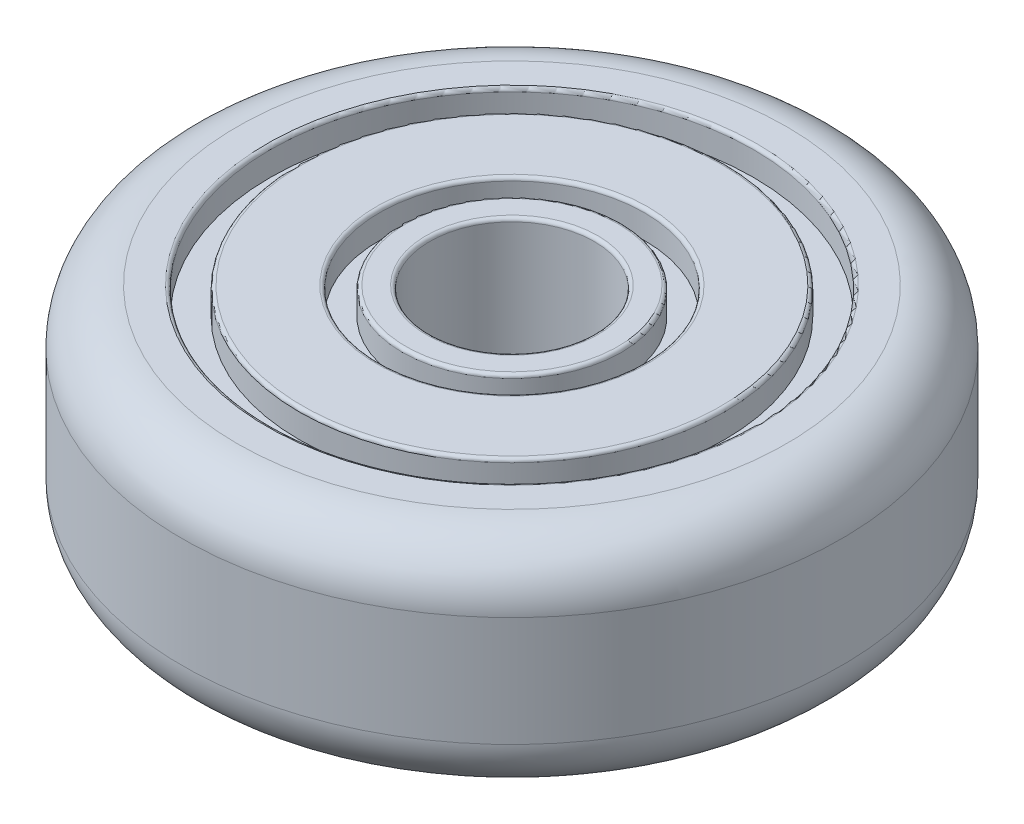
ISO-10303-21;
HEADER;
FILE_DESCRIPTION(('STEP AP214'),'2;1');
FILE_NAME('part.step','',(''),(''),'','','');
FILE_SCHEMA(('AUTOMOTIVE_DESIGN { 1 0 10303 214 1 1 1 1 }'));
ENDSEC;
DATA;
#1=APPLICATION_CONTEXT('core data for automotive mechanical design processes');
#2=APPLICATION_PROTOCOL_DEFINITION('international standard','automotive_design',2000,#1);
#3=PRODUCT_CONTEXT('',#1,'mechanical');
#4=PRODUCT('Part','Part','',(#3));
#5=PRODUCT_RELATED_PRODUCT_CATEGORY('part','',(#4));
#6=PRODUCT_DEFINITION_FORMATION('','',#4);
#7=PRODUCT_DEFINITION_CONTEXT('part definition',#1,'design');
#8=PRODUCT_DEFINITION('design','',#6,#7);
#9=PRODUCT_DEFINITION_SHAPE('','',#8);
#10=(LENGTH_UNIT() NAMED_UNIT(*) SI_UNIT(.MILLI.,.METRE.));
#11=(NAMED_UNIT(*) PLANE_ANGLE_UNIT() SI_UNIT($,.RADIAN.));
#12=(NAMED_UNIT(*) SI_UNIT($,.STERADIAN.) SOLID_ANGLE_UNIT());
#13=UNCERTAINTY_MEASURE_WITH_UNIT(LENGTH_MEASURE(1.E-05),#10,'distance_accuracy_value','');
#14=(GEOMETRIC_REPRESENTATION_CONTEXT(3) GLOBAL_UNCERTAINTY_ASSIGNED_CONTEXT((#13)) GLOBAL_UNIT_ASSIGNED_CONTEXT((#10,
#11,#12)) REPRESENTATION_CONTEXT('',''));
#15=CARTESIAN_POINT('',(0.,0.,0.));
#16=DIRECTION('',(0.,0.,1.));
#17=DIRECTION('',(1.,0.,0.));
#18=AXIS2_PLACEMENT_3D('',#15,#16,#17);
#19=CARTESIAN_POINT('',(0.,0.,0.));
#20=DIRECTION('',(0.,1.,0.));
#21=DIRECTION('',(0.,0.,-1.));
#22=AXIS2_PLACEMENT_3D('',#19,#20,#21);
#23=PLANE('',#22);
#24=CARTESIAN_POINT('',(0.,0.,0.));
#25=DIRECTION('',(0.,-1.,0.));
#26=DIRECTION('',(0.,0.,-1.));
#27=AXIS2_PLACEMENT_3D('',#24,#25,#26);
#28=CIRCLE('',#27,3.);
#29=CARTESIAN_POINT('',(0.,0.,-3.));
#30=VERTEX_POINT('',#29);
#31=EDGE_CURVE('E96',#30,#30,#28,.T.);
#32=ORIENTED_EDGE('',*,*,#31,.F.);
#33=EDGE_LOOP('',(#32));
#34=FACE_BOUND('',#33,.T.);
#35=CARTESIAN_POINT('',(0.,0.,0.));
#36=DIRECTION('',(0.,-1.,0.));
#37=DIRECTION('',(0.,0.,-1.));
#38=AXIS2_PLACEMENT_3D('',#35,#36,#37);
#39=CIRCLE('',#38,3.99081324353973);
#40=CARTESIAN_POINT('',(0.,0.,-3.99081324353973));
#41=VERTEX_POINT('',#40);
#42=EDGE_CURVE('E128',#41,#41,#39,.T.);
#43=ORIENTED_EDGE('',*,*,#42,.T.);
#44=EDGE_LOOP('',(#43));
#45=FACE_BOUND('',#44,.T.);
#46=ADVANCED_FACE('F46',(#34,#45),#23,.F.);
#47=CARTESIAN_POINT('',(0.,8.,0.));
#48=DIRECTION('',(0.,1.,0.));
#49=DIRECTION('',(0.,0.,-1.));
#50=AXIS2_PLACEMENT_3D('',#47,#48,#49);
#51=PLANE('',#50);
#52=CARTESIAN_POINT('',(0.,8.,0.));
#53=DIRECTION('',(0.,-1.,0.));
#54=DIRECTION('',(0.,0.,-1.));
#55=AXIS2_PLACEMENT_3D('',#52,#53,#54);
#56=CIRCLE('',#55,3.125);
#57=CARTESIAN_POINT('',(0.,8.,-3.125));
#58=VERTEX_POINT('',#57);
#59=EDGE_CURVE('E69',#58,#58,#56,.F.);
#60=ORIENTED_EDGE('',*,*,#59,.F.);
#61=EDGE_LOOP('',(#60));
#62=FACE_BOUND('',#61,.T.);
#63=CARTESIAN_POINT('',(0.,8.,0.));
#64=DIRECTION('',(0.,-1.,0.));
#65=DIRECTION('',(0.,0.,-1.));
#66=AXIS2_PLACEMENT_3D('',#63,#64,#65);
#67=CIRCLE('',#66,3.86581324353973);
#68=CARTESIAN_POINT('',(0.,8.,-3.86581324353973));
#69=VERTEX_POINT('',#68);
#70=EDGE_CURVE('E72',#69,#69,#67,.T.);
#71=ORIENTED_EDGE('',*,*,#70,.F.);
#72=EDGE_LOOP('',(#71));
#73=FACE_BOUND('',#72,.T.);
#74=ADVANCED_FACE('F176',(#62,#73),#51,.T.);
#75=CARTESIAN_POINT('',(0.,8.,0.));
#76=DIRECTION('',(0.,-1.,0.));
#77=DIRECTION('',(0.,0.,-1.));
#78=AXIS2_PLACEMENT_3D('',#75,#76,#77);
#79=CIRCLE('',#78,8.92068996697586);
#80=CARTESIAN_POINT('',(0.,8.,-8.92068996697586));
#81=VERTEX_POINT('',#80);
#82=EDGE_CURVE('E78',#81,#81,#79,.F.);
#83=ORIENTED_EDGE('',*,*,#82,.F.);
#84=EDGE_LOOP('',(#83));
#85=FACE_BOUND('',#84,.T.);
#86=CARTESIAN_POINT('',(0.,8.,0.));
#87=DIRECTION('',(0.,-1.,0.));
#88=DIRECTION('',(0.,0.,-1.));
#89=AXIS2_PLACEMENT_3D('',#86,#87,#88);
#90=CIRCLE('',#89,10.);
#91=CARTESIAN_POINT('',(0.,8.,-10.));
#92=VERTEX_POINT('',#91);
#93=EDGE_CURVE('E84',#92,#92,#90,.T.);
#94=ORIENTED_EDGE('',*,*,#93,.F.);
#95=EDGE_LOOP('',(#94));
#96=FACE_BOUND('',#95,.T.);
#97=ADVANCED_FACE('F181',(#85,#96),#51,.T.);
#98=CARTESIAN_POINT('',(0.,0.,0.));
#99=DIRECTION('',(0.,-1.,0.));
#100=DIRECTION('',(0.,0.,-1.));
#101=AXIS2_PLACEMENT_3D('',#98,#99,#100);
#102=CIRCLE('',#101,8.79568996697586);
#103=CARTESIAN_POINT('',(0.,0.,-8.79568996697586));
#104=VERTEX_POINT('',#103);
#105=EDGE_CURVE('E112',#104,#104,#102,.T.);
#106=ORIENTED_EDGE('',*,*,#105,.F.);
#107=EDGE_LOOP('',(#106));
#108=FACE_BOUND('',#107,.T.);
#109=CARTESIAN_POINT('',(0.,0.,0.));
#110=DIRECTION('',(0.,-1.,0.));
#111=DIRECTION('',(0.,0.,-1.));
#112=AXIS2_PLACEMENT_3D('',#109,#110,#111);
#113=CIRCLE('',#112,10.);
#114=CARTESIAN_POINT('',(0.,0.,-10.));
#115=VERTEX_POINT('',#114);
#116=EDGE_CURVE('E87',#115,#115,#113,.F.);
#117=ORIENTED_EDGE('',*,*,#116,.F.);
#118=EDGE_LOOP('',(#117));
#119=FACE_BOUND('',#118,.T.);
#120=ADVANCED_FACE('F157',(#108,#119),#23,.F.);
#121=CARTESIAN_POINT('',(0.,8.,0.));
#122=DIRECTION('',(0.,-1.,0.));
#123=DIRECTION('',(0.,0.,1.));
#124=AXIS2_PLACEMENT_3D('',#121,#122,#123);
#125=CYLINDRICAL_SURFACE('',#124,12.);
#126=CARTESIAN_POINT('',(0.,2.,0.));
#127=DIRECTION('',(0.,-1.,0.));
#128=DIRECTION('',(0.,0.,-1.));
#129=AXIS2_PLACEMENT_3D('',#126,#127,#128);
#130=CIRCLE('',#129,12.);
#131=CARTESIAN_POINT('',(0.,2.,-12.));
#132=VERTEX_POINT('',#131);
#133=EDGE_CURVE('E90',#132,#132,#130,.T.);
#134=ORIENTED_EDGE('',*,*,#133,.F.);
#135=EDGE_LOOP('',(#134));
#136=FACE_BOUND('',#135,.T.);
#137=CARTESIAN_POINT('',(0.,6.,0.));
#138=DIRECTION('',(0.,-1.,0.));
#139=DIRECTION('',(0.,0.,-1.));
#140=AXIS2_PLACEMENT_3D('',#137,#138,#139);
#141=CIRCLE('',#140,12.);
#142=CARTESIAN_POINT('',(0.,6.,-12.));
#143=VERTEX_POINT('',#142);
#144=EDGE_CURVE('E93',#143,#143,#141,.F.);
#145=ORIENTED_EDGE('',*,*,#144,.F.);
#146=EDGE_LOOP('',(#145));
#147=FACE_BOUND('',#146,.T.);
#148=ADVANCED_FACE('F189',(#136,#147),#125,.T.);
#149=CARTESIAN_POINT('',(0.,8.,0.));
#150=DIRECTION('',(0.,-1.,0.));
#151=DIRECTION('',(0.,0.,1.));
#152=AXIS2_PLACEMENT_3D('',#149,#150,#151);
#153=CYLINDRICAL_SURFACE('',#152,3.);
#154=CARTESIAN_POINT('',(0.,7.875,0.));
#155=DIRECTION('',(0.,-1.,0.));
#156=DIRECTION('',(0.,0.,-1.));
#157=AXIS2_PLACEMENT_3D('',#154,#155,#156);
#158=CIRCLE('',#157,3.);
#159=CARTESIAN_POINT('',(0.,7.875,-3.));
#160=VERTEX_POINT('',#159);
#161=EDGE_CURVE('E75',#160,#160,#158,.T.);
#162=ORIENTED_EDGE('',*,*,#161,.F.);
#163=EDGE_LOOP('',(#162));
#164=FACE_BOUND('',#163,.T.);
#165=ORIENTED_EDGE('',*,*,#31,.T.);
#166=EDGE_LOOP('',(#165));
#167=FACE_BOUND('',#166,.T.);
#168=ADVANCED_FACE('F196',(#164,#167),#153,.F.);
#169=CARTESIAN_POINT('',(0.,2.,0.));
#170=DIRECTION('',(0.,1.,0.));
#171=DIRECTION('',(0.,0.,-1.));
#172=AXIS2_PLACEMENT_3D('',#169,#170,#171);
#173=TOROIDAL_SURFACE('',#172,10.,2.);
#174=ORIENTED_EDGE('',*,*,#116,.T.);
#175=EDGE_LOOP('',(#174));
#176=FACE_BOUND('',#175,.T.);
#177=ORIENTED_EDGE('',*,*,#133,.T.);
#178=EDGE_LOOP('',(#177));
#179=FACE_BOUND('',#178,.T.);
#180=ADVANCED_FACE('F203',(#176,#179),#173,.T.);
#181=CARTESIAN_POINT('',(0.,6.,0.));
#182=DIRECTION('',(0.,1.,0.));
#183=DIRECTION('',(0.,0.,-1.));
#184=AXIS2_PLACEMENT_3D('',#181,#182,#183);
#185=TOROIDAL_SURFACE('',#184,10.,2.);
#186=ORIENTED_EDGE('',*,*,#144,.T.);
#187=EDGE_LOOP('',(#186));
#188=FACE_BOUND('',#187,.T.);
#189=ORIENTED_EDGE('',*,*,#93,.T.);
#190=EDGE_LOOP('',(#189));
#191=FACE_BOUND('',#190,.T.);
#192=ADVANCED_FACE('F206',(#188,#191),#185,.T.);
#193=CARTESIAN_POINT('',(0.,7.,0.));
#194=DIRECTION('',(0.,1.,0.));
#195=DIRECTION('',(0.,0.,-1.));
#196=AXIS2_PLACEMENT_3D('',#193,#194,#195);
#197=CYLINDRICAL_SURFACE('',#196,7.7454866043456);
#198=CARTESIAN_POINT('',(0.,7.875,0.));
#199=DIRECTION('',(0.,-1.,0.));
#200=DIRECTION('',(0.,0.,-1.));
#201=AXIS2_PLACEMENT_3D('',#198,#199,#200);
#202=CIRCLE('',#201,7.7454866043456);
#203=CARTESIAN_POINT('',(0.,7.875,-7.7454866043456));
#204=VERTEX_POINT('',#203);
#205=EDGE_CURVE('E11',#204,#204,#202,.F.);
#206=ORIENTED_EDGE('',*,*,#205,.F.);
#207=EDGE_LOOP('',(#206));
#208=FACE_BOUND('',#207,.T.);
#209=CARTESIAN_POINT('',(0.,7.,0.));
#210=DIRECTION('',(0.,-1.,0.));
#211=DIRECTION('',(0.,0.,-1.));
#212=AXIS2_PLACEMENT_3D('',#209,#210,#211);
#213=CIRCLE('',#212,7.7454866043456);
#214=CARTESIAN_POINT('',(0.,7.,-7.7454866043456));
#215=VERTEX_POINT('',#214);
#216=EDGE_CURVE('E102',#215,#215,#213,.T.);
#217=ORIENTED_EDGE('',*,*,#216,.F.);
#218=EDGE_LOOP('',(#217));
#219=FACE_BOUND('',#218,.T.);
#220=ADVANCED_FACE('F214',(#208,#219),#197,.T.);
#221=CARTESIAN_POINT('',(0.,7.,0.));
#222=DIRECTION('',(0.,1.,0.));
#223=DIRECTION('',(0.,0.,-1.));
#224=AXIS2_PLACEMENT_3D('',#221,#222,#223);
#225=CYLINDRICAL_SURFACE('',#224,8.79568996697586);
#226=CARTESIAN_POINT('',(0.,7.875,0.));
#227=DIRECTION('',(0.,-1.,0.));
#228=DIRECTION('',(0.,0.,-1.));
#229=AXIS2_PLACEMENT_3D('',#226,#227,#228);
#230=CIRCLE('',#229,8.79568996697586);
#231=CARTESIAN_POINT('',(0.,7.875,-8.79568996697586));
#232=VERTEX_POINT('',#231);
#233=EDGE_CURVE('E81',#232,#232,#230,.T.);
#234=ORIENTED_EDGE('',*,*,#233,.F.);
#235=EDGE_LOOP('',(#234));
#236=FACE_BOUND('',#235,.T.);
#237=CARTESIAN_POINT('',(0.,7.,0.));
#238=DIRECTION('',(0.,-1.,0.));
#239=DIRECTION('',(0.,0.,-1.));
#240=AXIS2_PLACEMENT_3D('',#237,#238,#239);
#241=CIRCLE('',#240,8.79568996697586);
#242=CARTESIAN_POINT('',(0.,7.,-8.79568996697586));
#243=VERTEX_POINT('',#242);
#244=EDGE_CURVE('E99',#243,#243,#241,.T.);
#245=ORIENTED_EDGE('',*,*,#244,.T.);
#246=EDGE_LOOP('',(#245));
#247=FACE_BOUND('',#246,.T.);
#248=ADVANCED_FACE('F221',(#236,#247),#225,.F.);
#249=CARTESIAN_POINT('',(0.,7.,0.));
#250=DIRECTION('',(0.,1.,0.));
#251=DIRECTION('',(0.,0.,-1.));
#252=AXIS2_PLACEMENT_3D('',#249,#250,#251);
#253=PLANE('',#252);
#254=ORIENTED_EDGE('',*,*,#216,.T.);
#255=EDGE_LOOP('',(#254));
#256=FACE_BOUND('',#255,.T.);
#257=ORIENTED_EDGE('',*,*,#244,.F.);
#258=EDGE_LOOP('',(#257));
#259=FACE_BOUND('',#258,.T.);
#260=ADVANCED_FACE('F255',(#256,#259),#253,.T.);
#261=CARTESIAN_POINT('',(0.,8.,0.));
#262=DIRECTION('',(0.,-1.,0.));
#263=DIRECTION('',(0.,0.,-1.));
#264=AXIS2_PLACEMENT_3D('',#261,#262,#263);
#265=CIRCLE('',#264,4.94705703683497);
#266=CARTESIAN_POINT('',(0.,8.,-4.94705703683497));
#267=VERTEX_POINT('',#266);
#268=EDGE_CURVE('E53',#267,#267,#265,.F.);
#269=ORIENTED_EDGE('',*,*,#268,.F.);
#270=EDGE_LOOP('',(#269));
#271=FACE_BOUND('',#270,.T.);
#272=CARTESIAN_POINT('',(0.,8.,0.));
#273=DIRECTION('',(0.,-1.,0.));
#274=DIRECTION('',(0.,0.,-1.));
#275=AXIS2_PLACEMENT_3D('',#272,#273,#274);
#276=CIRCLE('',#275,7.6204866043456);
#277=CARTESIAN_POINT('',(0.,8.,-7.6204866043456));
#278=VERTEX_POINT('',#277);
#279=EDGE_CURVE('E57',#278,#278,#276,.T.);
#280=ORIENTED_EDGE('',*,*,#279,.F.);
#281=EDGE_LOOP('',(#280));
#282=FACE_BOUND('',#281,.T.);
#283=ADVANCED_FACE('F184',(#271,#282),#51,.T.);
#284=CARTESIAN_POINT('',(0.,7.,0.));
#285=DIRECTION('',(0.,1.,0.));
#286=DIRECTION('',(0.,0.,-1.));
#287=AXIS2_PLACEMENT_3D('',#284,#285,#286);
#288=CYLINDRICAL_SURFACE('',#287,3.99081324353973);
#289=CARTESIAN_POINT('',(0.,7.875,0.));
#290=DIRECTION('',(0.,-1.,0.));
#291=DIRECTION('',(0.,0.,-1.));
#292=AXIS2_PLACEMENT_3D('',#289,#290,#291);
#293=CIRCLE('',#292,3.99081324353973);
#294=CARTESIAN_POINT('',(0.,7.875,-3.99081324353973));
#295=VERTEX_POINT('',#294);
#296=EDGE_CURVE('E66',#295,#295,#293,.F.);
#297=ORIENTED_EDGE('',*,*,#296,.F.);
#298=EDGE_LOOP('',(#297));
#299=FACE_BOUND('',#298,.T.);
#300=CARTESIAN_POINT('',(0.,7.,0.));
#301=DIRECTION('',(0.,-1.,0.));
#302=DIRECTION('',(0.,0.,-1.));
#303=AXIS2_PLACEMENT_3D('',#300,#301,#302);
#304=CIRCLE('',#303,3.99081324353973);
#305=CARTESIAN_POINT('',(0.,7.,-3.99081324353973));
#306=VERTEX_POINT('',#305);
#307=EDGE_CURVE('E108',#306,#306,#304,.T.);
#308=ORIENTED_EDGE('',*,*,#307,.F.);
#309=EDGE_LOOP('',(#308));
#310=FACE_BOUND('',#309,.T.);
#311=ADVANCED_FACE('F245',(#299,#310),#288,.T.);
#312=CARTESIAN_POINT('',(0.,7.,0.));
#313=DIRECTION('',(0.,1.,0.));
#314=DIRECTION('',(0.,0.,-1.));
#315=AXIS2_PLACEMENT_3D('',#312,#313,#314);
#316=CYLINDRICAL_SURFACE('',#315,4.82205703683497);
#317=CARTESIAN_POINT('',(0.,7.875,0.));
#318=DIRECTION('',(0.,-1.,0.));
#319=DIRECTION('',(0.,0.,-1.));
#320=AXIS2_PLACEMENT_3D('',#317,#318,#319);
#321=CIRCLE('',#320,4.82205703683497);
#322=CARTESIAN_POINT('',(0.,7.875,-4.82205703683497));
#323=VERTEX_POINT('',#322);
#324=EDGE_CURVE('E61',#323,#323,#321,.T.);
#325=ORIENTED_EDGE('',*,*,#324,.F.);
#326=EDGE_LOOP('',(#325));
#327=FACE_BOUND('',#326,.T.);
#328=CARTESIAN_POINT('',(0.,7.,0.));
#329=DIRECTION('',(0.,-1.,0.));
#330=DIRECTION('',(0.,0.,-1.));
#331=AXIS2_PLACEMENT_3D('',#328,#329,#330);
#332=CIRCLE('',#331,4.82205703683497);
#333=CARTESIAN_POINT('',(0.,7.,-4.82205703683497));
#334=VERTEX_POINT('',#333);
#335=EDGE_CURVE('E105',#334,#334,#332,.T.);
#336=ORIENTED_EDGE('',*,*,#335,.T.);
#337=EDGE_LOOP('',(#336));
#338=FACE_BOUND('',#337,.T.);
#339=ADVANCED_FACE('F172',(#327,#338),#316,.F.);
#340=CARTESIAN_POINT('',(0.,7.,0.));
#341=DIRECTION('',(0.,1.,0.));
#342=DIRECTION('',(0.,0.,-1.));
#343=AXIS2_PLACEMENT_3D('',#340,#341,#342);
#344=PLANE('',#343);
#345=ORIENTED_EDGE('',*,*,#307,.T.);
#346=EDGE_LOOP('',(#345));
#347=FACE_BOUND('',#346,.T.);
#348=ORIENTED_EDGE('',*,*,#335,.F.);
#349=EDGE_LOOP('',(#348));
#350=FACE_BOUND('',#349,.T.);
#351=ADVANCED_FACE('F163',(#347,#350),#344,.T.);
#352=CARTESIAN_POINT('',(0.,1.,0.));
#353=DIRECTION('',(0.,-1.,0.));
#354=DIRECTION('',(0.,0.,1.));
#355=AXIS2_PLACEMENT_3D('',#352,#353,#354);
#356=CYLINDRICAL_SURFACE('',#355,7.7454866043456);
#357=CARTESIAN_POINT('',(0.,1.,0.));
#358=DIRECTION('',(0.,-1.,0.));
#359=DIRECTION('',(0.,0.,-1.));
#360=AXIS2_PLACEMENT_3D('',#357,#358,#359);
#361=CIRCLE('',#360,7.7454866043456);
#362=CARTESIAN_POINT('',(0.,1.,-7.7454866043456));
#363=VERTEX_POINT('',#362);
#364=EDGE_CURVE('E115',#363,#363,#361,.T.);
#365=ORIENTED_EDGE('',*,*,#364,.T.);
#366=EDGE_LOOP('',(#365));
#367=FACE_BOUND('',#366,.T.);
#368=CARTESIAN_POINT('',(0.,0.,0.));
#369=DIRECTION('',(0.,-1.,0.));
#370=DIRECTION('',(0.,0.,-1.));
#371=AXIS2_PLACEMENT_3D('',#368,#369,#370);
#372=CIRCLE('',#371,7.7454866043456);
#373=CARTESIAN_POINT('',(0.,0.,-7.7454866043456));
#374=VERTEX_POINT('',#373);
#375=EDGE_CURVE('E116',#374,#374,#372,.T.);
#376=ORIENTED_EDGE('',*,*,#375,.F.);
#377=EDGE_LOOP('',(#376));
#378=FACE_BOUND('',#377,.T.);
#379=ADVANCED_FACE('F160',(#367,#378),#356,.T.);
#380=CARTESIAN_POINT('',(0.,1.,0.));
#381=DIRECTION('',(0.,-1.,0.));
#382=DIRECTION('',(0.,0.,1.));
#383=AXIS2_PLACEMENT_3D('',#380,#381,#382);
#384=CYLINDRICAL_SURFACE('',#383,8.79568996697586);
#385=CARTESIAN_POINT('',(0.,1.,0.));
#386=DIRECTION('',(0.,-1.,0.));
#387=DIRECTION('',(0.,0.,-1.));
#388=AXIS2_PLACEMENT_3D('',#385,#386,#387);
#389=CIRCLE('',#388,8.79568996697586);
#390=CARTESIAN_POINT('',(0.,1.,-8.79568996697586));
#391=VERTEX_POINT('',#390);
#392=EDGE_CURVE('E111',#391,#391,#389,.T.);
#393=ORIENTED_EDGE('',*,*,#392,.F.);
#394=EDGE_LOOP('',(#393));
#395=FACE_BOUND('',#394,.T.);
#396=ORIENTED_EDGE('',*,*,#105,.T.);
#397=EDGE_LOOP('',(#396));
#398=FACE_BOUND('',#397,.T.);
#399=ADVANCED_FACE('F162',(#395,#398),#384,.F.);
#400=CARTESIAN_POINT('',(0.,1.,0.));
#401=DIRECTION('',(0.,-1.,0.));
#402=DIRECTION('',(0.,0.,-1.));
#403=AXIS2_PLACEMENT_3D('',#400,#401,#402);
#404=PLANE('',#403);
#405=ORIENTED_EDGE('',*,*,#364,.F.);
#406=EDGE_LOOP('',(#405));
#407=FACE_BOUND('',#406,.T.);
#408=ORIENTED_EDGE('',*,*,#392,.T.);
#409=EDGE_LOOP('',(#408));
#410=FACE_BOUND('',#409,.T.);
#411=ADVANCED_FACE('F155',(#407,#410),#404,.T.);
#412=CARTESIAN_POINT('',(0.,0.,0.));
#413=DIRECTION('',(0.,-1.,0.));
#414=DIRECTION('',(0.,0.,-1.));
#415=AXIS2_PLACEMENT_3D('',#412,#413,#414);
#416=CIRCLE('',#415,4.82205703683497);
#417=CARTESIAN_POINT('',(0.,0.,-4.82205703683497));
#418=VERTEX_POINT('',#417);
#419=EDGE_CURVE('E124',#418,#418,#416,.T.);
#420=ORIENTED_EDGE('',*,*,#419,.F.);
#421=EDGE_LOOP('',(#420));
#422=FACE_BOUND('',#421,.T.);
#423=ORIENTED_EDGE('',*,*,#375,.T.);
#424=EDGE_LOOP('',(#423));
#425=FACE_BOUND('',#424,.T.);
#426=ADVANCED_FACE('F152',(#422,#425),#23,.F.);
#427=CARTESIAN_POINT('',(0.,1.,0.));
#428=DIRECTION('',(0.,-1.,0.));
#429=DIRECTION('',(0.,0.,1.));
#430=AXIS2_PLACEMENT_3D('',#427,#428,#429);
#431=CYLINDRICAL_SURFACE('',#430,3.99081324353973);
#432=CARTESIAN_POINT('',(0.,1.,0.));
#433=DIRECTION('',(0.,-1.,0.));
#434=DIRECTION('',(0.,0.,-1.));
#435=AXIS2_PLACEMENT_3D('',#432,#433,#434);
#436=CIRCLE('',#435,3.99081324353973);
#437=CARTESIAN_POINT('',(0.,1.,-3.99081324353973));
#438=VERTEX_POINT('',#437);
#439=EDGE_CURVE('E127',#438,#438,#436,.T.);
#440=ORIENTED_EDGE('',*,*,#439,.T.);
#441=EDGE_LOOP('',(#440));
#442=FACE_BOUND('',#441,.T.);
#443=ORIENTED_EDGE('',*,*,#42,.F.);
#444=EDGE_LOOP('',(#443));
#445=FACE_BOUND('',#444,.T.);
#446=ADVANCED_FACE('F136',(#442,#445),#431,.T.);
#447=CARTESIAN_POINT('',(0.,1.,0.));
#448=DIRECTION('',(0.,-1.,0.));
#449=DIRECTION('',(0.,0.,1.));
#450=AXIS2_PLACEMENT_3D('',#447,#448,#449);
#451=CYLINDRICAL_SURFACE('',#450,4.82205703683497);
#452=CARTESIAN_POINT('',(0.,1.,0.));
#453=DIRECTION('',(0.,-1.,0.));
#454=DIRECTION('',(0.,0.,-1.));
#455=AXIS2_PLACEMENT_3D('',#452,#453,#454);
#456=CIRCLE('',#455,4.82205703683497);
#457=CARTESIAN_POINT('',(0.,1.,-4.82205703683497));
#458=VERTEX_POINT('',#457);
#459=EDGE_CURVE('E119',#458,#458,#456,.T.);
#460=ORIENTED_EDGE('',*,*,#459,.F.);
#461=EDGE_LOOP('',(#460));
#462=FACE_BOUND('',#461,.T.);
#463=ORIENTED_EDGE('',*,*,#419,.T.);
#464=EDGE_LOOP('',(#463));
#465=FACE_BOUND('',#464,.T.);
#466=ADVANCED_FACE('F143',(#462,#465),#451,.F.);
#467=CARTESIAN_POINT('',(0.,1.,0.));
#468=DIRECTION('',(0.,-1.,0.));
#469=DIRECTION('',(0.,0.,-1.));
#470=AXIS2_PLACEMENT_3D('',#467,#468,#469);
#471=PLANE('',#470);
#472=ORIENTED_EDGE('',*,*,#439,.F.);
#473=EDGE_LOOP('',(#472));
#474=FACE_BOUND('',#473,.T.);
#475=ORIENTED_EDGE('',*,*,#459,.T.);
#476=EDGE_LOOP('',(#475));
#477=FACE_BOUND('',#476,.T.);
#478=ADVANCED_FACE('F139',(#474,#477),#471,.T.);
#479=CARTESIAN_POINT('',(0.,7.875,0.));
#480=DIRECTION('',(0.,1.,0.));
#481=DIRECTION('',(0.,0.,-1.));
#482=AXIS2_PLACEMENT_3D('',#479,#480,#481);
#483=TOROIDAL_SURFACE('',#482,8.92068996697586,0.125);
#484=ORIENTED_EDGE('',*,*,#82,.T.);
#485=EDGE_LOOP('',(#484));
#486=FACE_BOUND('',#485,.T.);
#487=ORIENTED_EDGE('',*,*,#233,.T.);
#488=EDGE_LOOP('',(#487));
#489=FACE_BOUND('',#488,.T.);
#490=ADVANCED_FACE('F142',(#486,#489),#483,.T.);
#491=CARTESIAN_POINT('',(0.,7.875,0.));
#492=DIRECTION('',(0.,1.,0.));
#493=DIRECTION('',(0.,0.,-1.));
#494=AXIS2_PLACEMENT_3D('',#491,#492,#493);
#495=TOROIDAL_SURFACE('',#494,3.125,0.125);
#496=ORIENTED_EDGE('',*,*,#59,.T.);
#497=EDGE_LOOP('',(#496));
#498=FACE_BOUND('',#497,.T.);
#499=ORIENTED_EDGE('',*,*,#161,.T.);
#500=EDGE_LOOP('',(#499));
#501=FACE_BOUND('',#500,.T.);
#502=ADVANCED_FACE('F227',(#498,#501),#495,.T.);
#503=CARTESIAN_POINT('',(0.,7.875,0.));
#504=DIRECTION('',(0.,1.,0.));
#505=DIRECTION('',(0.,0.,-1.));
#506=AXIS2_PLACEMENT_3D('',#503,#504,#505);
#507=TOROIDAL_SURFACE('',#506,3.86581324353973,0.125);
#508=ORIENTED_EDGE('',*,*,#296,.T.);
#509=EDGE_LOOP('',(#508));
#510=FACE_BOUND('',#509,.T.);
#511=ORIENTED_EDGE('',*,*,#70,.T.);
#512=EDGE_LOOP('',(#511));
#513=FACE_BOUND('',#512,.T.);
#514=ADVANCED_FACE('F231',(#510,#513),#507,.T.);
#515=CARTESIAN_POINT('',(0.,7.875,0.));
#516=DIRECTION('',(0.,1.,0.));
#517=DIRECTION('',(0.,0.,-1.));
#518=AXIS2_PLACEMENT_3D('',#515,#516,#517);
#519=TOROIDAL_SURFACE('',#518,4.94705703683497,0.125);
#520=ORIENTED_EDGE('',*,*,#268,.T.);
#521=EDGE_LOOP('',(#520));
#522=FACE_BOUND('',#521,.T.);
#523=ORIENTED_EDGE('',*,*,#324,.T.);
#524=EDGE_LOOP('',(#523));
#525=FACE_BOUND('',#524,.T.);
#526=ADVANCED_FACE('F234',(#522,#525),#519,.T.);
#527=CARTESIAN_POINT('',(0.,7.875,0.));
#528=DIRECTION('',(0.,1.,0.));
#529=DIRECTION('',(0.,0.,-1.));
#530=AXIS2_PLACEMENT_3D('',#527,#528,#529);
#531=TOROIDAL_SURFACE('',#530,7.6204866043456,0.125);
#532=ORIENTED_EDGE('',*,*,#205,.T.);
#533=EDGE_LOOP('',(#532));
#534=FACE_BOUND('',#533,.T.);
#535=ORIENTED_EDGE('',*,*,#279,.T.);
#536=EDGE_LOOP('',(#535));
#537=FACE_BOUND('',#536,.T.);
#538=ADVANCED_FACE('F48',(#534,#537),#531,.T.);
#539=CLOSED_SHELL('',(#46,#74,#97,#120,#148,#168,#180,#192,#220,#248,#260,#283,#311,#339,#351,
#379,#399,#411,#426,#446,#466,#478,#490,#502,#514,#526,#538));
#540=MANIFOLD_SOLID_BREP('B2',#539);
#541=ADVANCED_BREP_SHAPE_REPRESENTATION('',(#18,#540),#14);
#542=SHAPE_DEFINITION_REPRESENTATION(#9,#541);
ENDSEC;
END-ISO-10303-21;
